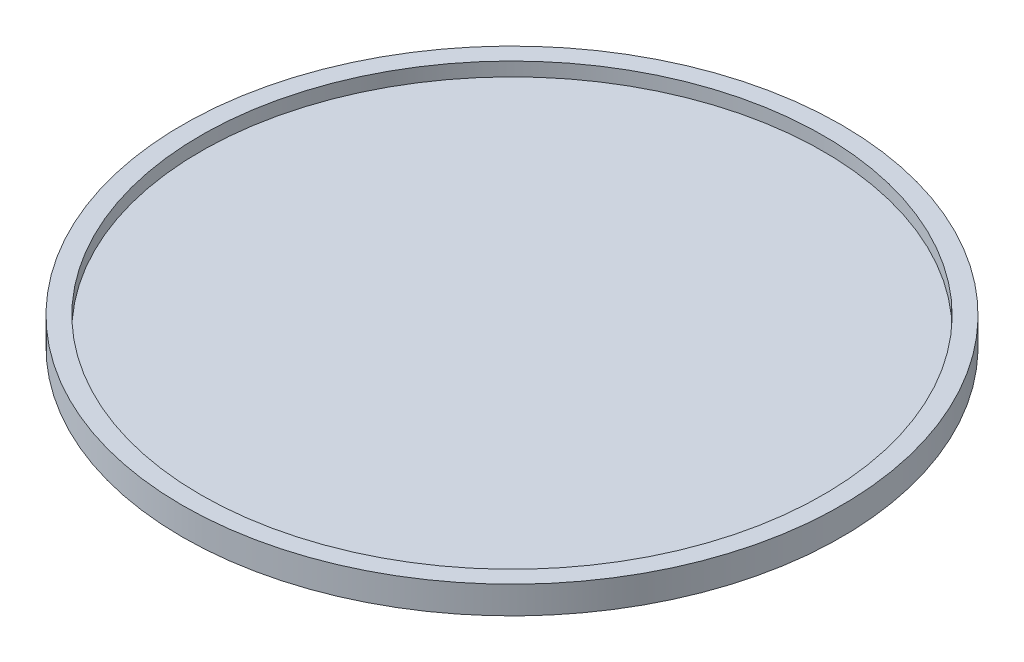
ISO-10303-21;
HEADER;
FILE_DESCRIPTION(('STEP AP214'),'2;1');
FILE_NAME('part.step','',(''),(''),'','','');
FILE_SCHEMA(('AUTOMOTIVE_DESIGN { 1 0 10303 214 1 1 1 1 }'));
ENDSEC;
DATA;
#1=APPLICATION_CONTEXT('core data for automotive mechanical design processes');
#2=APPLICATION_PROTOCOL_DEFINITION('international standard','automotive_design',2000,#1);
#3=PRODUCT_CONTEXT('',#1,'mechanical');
#4=PRODUCT('Part','Part','',(#3));
#5=PRODUCT_RELATED_PRODUCT_CATEGORY('part','',(#4));
#6=PRODUCT_DEFINITION_FORMATION('','',#4);
#7=PRODUCT_DEFINITION_CONTEXT('part definition',#1,'design');
#8=PRODUCT_DEFINITION('design','',#6,#7);
#9=PRODUCT_DEFINITION_SHAPE('','',#8);
#10=(LENGTH_UNIT() NAMED_UNIT(*) SI_UNIT(.MILLI.,.METRE.));
#11=(NAMED_UNIT(*) PLANE_ANGLE_UNIT() SI_UNIT($,.RADIAN.));
#12=(NAMED_UNIT(*) SI_UNIT($,.STERADIAN.) SOLID_ANGLE_UNIT());
#13=UNCERTAINTY_MEASURE_WITH_UNIT(LENGTH_MEASURE(1.E-05),#10,'distance_accuracy_value','');
#14=(GEOMETRIC_REPRESENTATION_CONTEXT(3) GLOBAL_UNCERTAINTY_ASSIGNED_CONTEXT((#13)) GLOBAL_UNIT_ASSIGNED_CONTEXT((#10,
#11,#12)) REPRESENTATION_CONTEXT('',''));
#15=CARTESIAN_POINT('',(0.,0.,0.));
#16=DIRECTION('',(0.,0.,1.));
#17=DIRECTION('',(1.,0.,0.));
#18=AXIS2_PLACEMENT_3D('',#15,#16,#17);
#19=CARTESIAN_POINT('',(0.,1.5,0.));
#20=DIRECTION('',(0.,-1.,0.));
#21=DIRECTION('',(0.,0.,-1.));
#22=AXIS2_PLACEMENT_3D('',#19,#20,#21);
#23=CYLINDRICAL_SURFACE('',#22,18.);
#24=CARTESIAN_POINT('',(0.,1.5,0.));
#25=DIRECTION('',(0.,1.,0.));
#26=DIRECTION('',(0.,0.,1.));
#27=AXIS2_PLACEMENT_3D('',#24,#25,#26);
#28=CIRCLE('',#27,18.);
#29=CARTESIAN_POINT('',(0.,1.5,18.));
#30=VERTEX_POINT('',#29);
#31=EDGE_CURVE('E10',#30,#30,#28,.T.);
#32=ORIENTED_EDGE('',*,*,#31,.F.);
#33=EDGE_LOOP('',(#32));
#34=FACE_BOUND('',#33,.T.);
#35=CARTESIAN_POINT('',(0.,0.,0.));
#36=DIRECTION('',(0.,1.,0.));
#37=DIRECTION('',(0.,0.,1.));
#38=AXIS2_PLACEMENT_3D('',#35,#36,#37);
#39=CIRCLE('',#38,18.);
#40=CARTESIAN_POINT('',(0.,0.,18.));
#41=VERTEX_POINT('',#40);
#42=EDGE_CURVE('E38',#41,#41,#39,.T.);
#43=ORIENTED_EDGE('',*,*,#42,.T.);
#44=EDGE_LOOP('',(#43));
#45=FACE_BOUND('',#44,.T.);
#46=ADVANCED_FACE('F35',(#34,#45),#23,.T.);
#47=CARTESIAN_POINT('',(0.,1.5,0.));
#48=DIRECTION('',(0.,1.,0.));
#49=DIRECTION('',(0.,0.,1.));
#50=AXIS2_PLACEMENT_3D('',#47,#48,#49);
#51=PLANE('',#50);
#52=CARTESIAN_POINT('',(0.,1.5,0.));
#53=DIRECTION('',(0.,1.,0.));
#54=DIRECTION('',(0.,0.,1.));
#55=AXIS2_PLACEMENT_3D('',#52,#53,#54);
#56=CIRCLE('',#55,17.);
#57=CARTESIAN_POINT('',(0.,1.5,17.));
#58=VERTEX_POINT('',#57);
#59=EDGE_CURVE('E47',#58,#58,#56,.T.);
#60=ORIENTED_EDGE('',*,*,#59,.F.);
#61=EDGE_LOOP('',(#60));
#62=FACE_BOUND('',#61,.T.);
#63=ORIENTED_EDGE('',*,*,#31,.T.);
#64=EDGE_LOOP('',(#63));
#65=FACE_BOUND('',#64,.T.);
#66=ADVANCED_FACE('F62',(#62,#65),#51,.T.);
#67=CARTESIAN_POINT('',(0.,0.,0.));
#68=DIRECTION('',(0.,1.,0.));
#69=DIRECTION('',(0.,0.,1.));
#70=AXIS2_PLACEMENT_3D('',#67,#68,#69);
#71=PLANE('',#70);
#72=ORIENTED_EDGE('',*,*,#42,.F.);
#73=EDGE_LOOP('',(#72));
#74=FACE_BOUND('',#73,.T.);
#75=ADVANCED_FACE('F58',(#74),#71,.F.);
#76=CARTESIAN_POINT('',(0.,0.75,0.));
#77=DIRECTION('',(0.,1.,0.));
#78=DIRECTION('',(0.,0.,1.));
#79=AXIS2_PLACEMENT_3D('',#76,#77,#78);
#80=CYLINDRICAL_SURFACE('',#79,17.);
#81=CARTESIAN_POINT('',(0.,0.75,0.));
#82=DIRECTION('',(0.,1.,0.));
#83=DIRECTION('',(0.,0.,1.));
#84=AXIS2_PLACEMENT_3D('',#81,#82,#83);
#85=CIRCLE('',#84,17.);
#86=CARTESIAN_POINT('',(0.,0.75,17.));
#87=VERTEX_POINT('',#86);
#88=EDGE_CURVE('E45',#87,#87,#85,.T.);
#89=ORIENTED_EDGE('',*,*,#88,.F.);
#90=EDGE_LOOP('',(#89));
#91=FACE_BOUND('',#90,.T.);
#92=ORIENTED_EDGE('',*,*,#59,.T.);
#93=EDGE_LOOP('',(#92));
#94=FACE_BOUND('',#93,.T.);
#95=ADVANCED_FACE('F55',(#91,#94),#80,.F.);
#96=CARTESIAN_POINT('',(0.,0.75,0.));
#97=DIRECTION('',(0.,1.,0.));
#98=DIRECTION('',(0.,0.,1.));
#99=AXIS2_PLACEMENT_3D('',#96,#97,#98);
#100=PLANE('',#99);
#101=ORIENTED_EDGE('',*,*,#88,.T.);
#102=EDGE_LOOP('',(#101));
#103=FACE_BOUND('',#102,.T.);
#104=ADVANCED_FACE('F53',(#103),#100,.T.);
#105=CLOSED_SHELL('',(#46,#66,#75,#95,#104));
#106=MANIFOLD_SOLID_BREP('B2',#105);
#107=ADVANCED_BREP_SHAPE_REPRESENTATION('',(#18,#106),#14);
#108=SHAPE_DEFINITION_REPRESENTATION(#9,#107);
ENDSEC;
END-ISO-10303-21;
